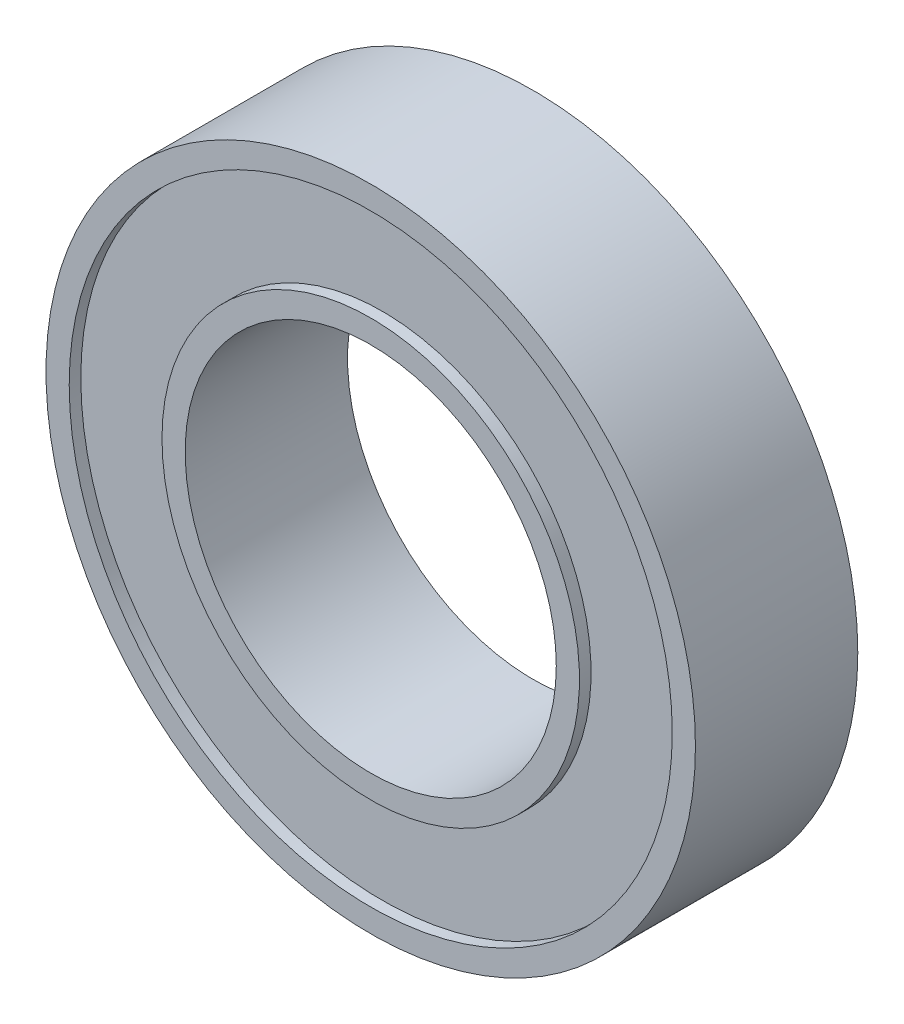
ISO-10303-21;
HEADER;
FILE_DESCRIPTION(('STEP AP214'),'2;1');
FILE_NAME('part.step','',(''),(''),'','','');
FILE_SCHEMA(('AUTOMOTIVE_DESIGN { 1 0 10303 214 1 1 1 1 }'));
ENDSEC;
DATA;
#1=APPLICATION_CONTEXT('core data for automotive mechanical design processes');
#2=APPLICATION_PROTOCOL_DEFINITION('international standard','automotive_design',2000,#1);
#3=PRODUCT_CONTEXT('',#1,'mechanical');
#4=PRODUCT('Part','Part','',(#3));
#5=PRODUCT_RELATED_PRODUCT_CATEGORY('part','',(#4));
#6=PRODUCT_DEFINITION_FORMATION('','',#4);
#7=PRODUCT_DEFINITION_CONTEXT('part definition',#1,'design');
#8=PRODUCT_DEFINITION('design','',#6,#7);
#9=PRODUCT_DEFINITION_SHAPE('','',#8);
#10=(LENGTH_UNIT() NAMED_UNIT(*) SI_UNIT(.MILLI.,.METRE.));
#11=(NAMED_UNIT(*) PLANE_ANGLE_UNIT() SI_UNIT($,.RADIAN.));
#12=(NAMED_UNIT(*) SI_UNIT($,.STERADIAN.) SOLID_ANGLE_UNIT());
#13=UNCERTAINTY_MEASURE_WITH_UNIT(LENGTH_MEASURE(1.E-05),#10,'distance_accuracy_value','');
#14=(GEOMETRIC_REPRESENTATION_CONTEXT(3) GLOBAL_UNCERTAINTY_ASSIGNED_CONTEXT((#13)) GLOBAL_UNIT_ASSIGNED_CONTEXT((#10,
#11,#12)) REPRESENTATION_CONTEXT('',''));
#15=CARTESIAN_POINT('',(0.,0.,0.));
#16=DIRECTION('',(0.,0.,1.));
#17=DIRECTION('',(1.,0.,0.));
#18=AXIS2_PLACEMENT_3D('',#15,#16,#17);
#19=CARTESIAN_POINT('',(0.,0.,-3.5));
#20=DIRECTION('',(0.,0.,1.));
#21=DIRECTION('',(1.,0.,0.));
#22=AXIS2_PLACEMENT_3D('',#19,#20,#21);
#23=PLANE('',#22);
#24=CARTESIAN_POINT('',(0.,0.,-3.5));
#25=DIRECTION('',(0.,0.,1.));
#26=DIRECTION('',(1.,0.,0.));
#27=AXIS2_PLACEMENT_3D('',#24,#25,#26);
#28=CIRCLE('',#27,8.);
#29=CARTESIAN_POINT('',(8.,0.,-3.5));
#30=VERTEX_POINT('',#29);
#31=EDGE_CURVE('E69',#30,#30,#28,.T.);
#32=ORIENTED_EDGE('',*,*,#31,.T.);
#33=EDGE_LOOP('',(#32));
#34=FACE_BOUND('',#33,.T.);
#35=CARTESIAN_POINT('',(0.,0.,-3.5));
#36=DIRECTION('',(0.,0.,1.));
#37=DIRECTION('',(1.,0.,0.));
#38=AXIS2_PLACEMENT_3D('',#35,#36,#37);
#39=CIRCLE('',#38,9.);
#40=CARTESIAN_POINT('',(9.,0.,-3.5));
#41=VERTEX_POINT('',#40);
#42=EDGE_CURVE('E80',#41,#41,#39,.T.);
#43=ORIENTED_EDGE('',*,*,#42,.F.);
#44=EDGE_LOOP('',(#43));
#45=FACE_BOUND('',#44,.T.);
#46=ADVANCED_FACE('F51',(#34,#45),#23,.F.);
#47=CARTESIAN_POINT('',(0.,0.,3.5));
#48=DIRECTION('',(0.,0.,1.));
#49=DIRECTION('',(1.,0.,0.));
#50=AXIS2_PLACEMENT_3D('',#47,#48,#49);
#51=PLANE('',#50);
#52=CARTESIAN_POINT('',(0.,0.,3.5));
#53=DIRECTION('',(0.,0.,1.));
#54=DIRECTION('',(1.,0.,0.));
#55=AXIS2_PLACEMENT_3D('',#52,#53,#54);
#56=CIRCLE('',#55,8.);
#57=CARTESIAN_POINT('',(8.,0.,3.5));
#58=VERTEX_POINT('',#57);
#59=EDGE_CURVE('E66',#58,#58,#56,.T.);
#60=ORIENTED_EDGE('',*,*,#59,.F.);
#61=EDGE_LOOP('',(#60));
#62=FACE_BOUND('',#61,.T.);
#63=CARTESIAN_POINT('',(0.,0.,3.5));
#64=DIRECTION('',(0.,0.,1.));
#65=DIRECTION('',(1.,0.,0.));
#66=AXIS2_PLACEMENT_3D('',#63,#64,#65);
#67=CIRCLE('',#66,9.);
#68=CARTESIAN_POINT('',(-9.,0.,3.5));
#69=VERTEX_POINT('',#68);
#70=EDGE_CURVE('E72',#69,#69,#67,.F.);
#71=ORIENTED_EDGE('',*,*,#70,.F.);
#72=EDGE_LOOP('',(#71));
#73=FACE_BOUND('',#72,.T.);
#74=ADVANCED_FACE('F130',(#62,#73),#51,.T.);
#75=CARTESIAN_POINT('',(0.,0.,3.5));
#76=DIRECTION('',(0.,0.,1.));
#77=DIRECTION('',(1.,0.,0.));
#78=AXIS2_PLACEMENT_3D('',#75,#76,#77);
#79=CIRCLE('',#78,13.);
#80=CARTESIAN_POINT('',(-13.,0.,3.5));
#81=VERTEX_POINT('',#80);
#82=EDGE_CURVE('E76',#81,#81,#79,.F.);
#83=ORIENTED_EDGE('',*,*,#82,.T.);
#84=EDGE_LOOP('',(#83));
#85=FACE_BOUND('',#84,.T.);
#86=CARTESIAN_POINT('',(0.,0.,3.5));
#87=DIRECTION('',(0.,0.,1.));
#88=DIRECTION('',(1.,0.,0.));
#89=AXIS2_PLACEMENT_3D('',#86,#87,#88);
#90=CIRCLE('',#89,14.);
#91=CARTESIAN_POINT('',(14.,0.,3.5));
#92=VERTEX_POINT('',#91);
#93=EDGE_CURVE('E10',#92,#92,#90,.T.);
#94=ORIENTED_EDGE('',*,*,#93,.T.);
#95=EDGE_LOOP('',(#94));
#96=FACE_BOUND('',#95,.T.);
#97=ADVANCED_FACE('F135',(#85,#96),#51,.T.);
#98=CARTESIAN_POINT('',(0.,0.,-3.5));
#99=DIRECTION('',(0.,0.,1.));
#100=DIRECTION('',(1.,0.,0.));
#101=AXIS2_PLACEMENT_3D('',#98,#99,#100);
#102=CIRCLE('',#101,13.);
#103=CARTESIAN_POINT('',(13.,0.,-3.5));
#104=VERTEX_POINT('',#103);
#105=EDGE_CURVE('E55',#104,#104,#102,.T.);
#106=ORIENTED_EDGE('',*,*,#105,.T.);
#107=EDGE_LOOP('',(#106));
#108=FACE_BOUND('',#107,.T.);
#109=CARTESIAN_POINT('',(0.,0.,-3.5));
#110=DIRECTION('',(0.,0.,1.));
#111=DIRECTION('',(1.,0.,0.));
#112=AXIS2_PLACEMENT_3D('',#109,#110,#111);
#113=CIRCLE('',#112,14.);
#114=CARTESIAN_POINT('',(14.,0.,-3.5));
#115=VERTEX_POINT('',#114);
#116=EDGE_CURVE('E60',#115,#115,#113,.T.);
#117=ORIENTED_EDGE('',*,*,#116,.F.);
#118=EDGE_LOOP('',(#117));
#119=FACE_BOUND('',#118,.T.);
#120=ADVANCED_FACE('F126',(#108,#119),#23,.F.);
#121=CARTESIAN_POINT('',(0.,0.,3.5));
#122=DIRECTION('',(0.,0.,-1.));
#123=DIRECTION('',(-1.,0.,0.));
#124=AXIS2_PLACEMENT_3D('',#121,#122,#123);
#125=CYLINDRICAL_SURFACE('',#124,14.);
#126=ORIENTED_EDGE('',*,*,#93,.F.);
#127=EDGE_LOOP('',(#126));
#128=FACE_BOUND('',#127,.T.);
#129=ORIENTED_EDGE('',*,*,#116,.T.);
#130=EDGE_LOOP('',(#129));
#131=FACE_BOUND('',#130,.T.);
#132=ADVANCED_FACE('F53',(#128,#131),#125,.T.);
#133=CARTESIAN_POINT('',(0.,0.,3.5));
#134=DIRECTION('',(0.,0.,-1.));
#135=DIRECTION('',(-1.,0.,0.));
#136=AXIS2_PLACEMENT_3D('',#133,#134,#135);
#137=CYLINDRICAL_SURFACE('',#136,8.);
#138=ORIENTED_EDGE('',*,*,#59,.T.);
#139=EDGE_LOOP('',(#138));
#140=FACE_BOUND('',#139,.T.);
#141=ORIENTED_EDGE('',*,*,#31,.F.);
#142=EDGE_LOOP('',(#141));
#143=FACE_BOUND('',#142,.T.);
#144=ADVANCED_FACE('F114',(#140,#143),#137,.F.);
#145=CARTESIAN_POINT('',(0.,0.,3.500012));
#146=DIRECTION('',(0.,0.,-1.));
#147=DIRECTION('',(-1.,0.,0.));
#148=AXIS2_PLACEMENT_3D('',#145,#146,#147);
#149=CYLINDRICAL_SURFACE('',#148,13.);
#150=CARTESIAN_POINT('',(0.,0.,3.));
#151=DIRECTION('',(0.,0.,1.));
#152=DIRECTION('',(1.,0.,0.));
#153=AXIS2_PLACEMENT_3D('',#150,#151,#152);
#154=CIRCLE('',#153,13.);
#155=CARTESIAN_POINT('',(-13.,0.,3.));
#156=VERTEX_POINT('',#155);
#157=EDGE_CURVE('E77',#156,#156,#154,.T.);
#158=CARTESIAN_POINT('',(-13.,0.,3.5));
#159=CARTESIAN_POINT('',(-13.,0.,3.49479166666667));
#160=CARTESIAN_POINT('',(-13.,0.,3.48958333333333));
#161=CARTESIAN_POINT('',(-13.,0.,3.47916666666667));
#162=CARTESIAN_POINT('',(-13.,0.,3.47395833333333));
#163=CARTESIAN_POINT('',(-13.,0.,3.46354166666667));
#164=CARTESIAN_POINT('',(-13.,0.,3.45833333333333));
#165=CARTESIAN_POINT('',(-13.,0.,3.44791666666667));
#166=CARTESIAN_POINT('',(-13.,0.,3.44270833333333));
#167=CARTESIAN_POINT('',(-13.,0.,3.43229166666667));
#168=CARTESIAN_POINT('',(-13.,0.,3.42708333333333));
#169=CARTESIAN_POINT('',(-13.,0.,3.41666666666667));
#170=CARTESIAN_POINT('',(-13.,0.,3.41145833333333));
#171=CARTESIAN_POINT('',(-13.,0.,3.40104166666667));
#172=CARTESIAN_POINT('',(-13.,0.,3.39583333333333));
#173=CARTESIAN_POINT('',(-13.,0.,3.38541666666667));
#174=CARTESIAN_POINT('',(-13.,0.,3.38020833333333));
#175=CARTESIAN_POINT('',(-13.,0.,3.36979166666667));
#176=CARTESIAN_POINT('',(-13.,0.,3.36458333333333));
#177=CARTESIAN_POINT('',(-13.,0.,3.35416666666667));
#178=CARTESIAN_POINT('',(-13.,0.,3.34895833333333));
#179=CARTESIAN_POINT('',(-13.,0.,3.33854166666667));
#180=CARTESIAN_POINT('',(-13.,0.,3.33333333333333));
#181=CARTESIAN_POINT('',(-13.,0.,3.32291666666667));
#182=CARTESIAN_POINT('',(-13.,0.,3.31770833333333));
#183=CARTESIAN_POINT('',(-13.,0.,3.30729166666667));
#184=CARTESIAN_POINT('',(-13.,0.,3.30208333333333));
#185=CARTESIAN_POINT('',(-13.,0.,3.29166666666667));
#186=CARTESIAN_POINT('',(-13.,0.,3.28645833333333));
#187=CARTESIAN_POINT('',(-13.,0.,3.27604166666667));
#188=CARTESIAN_POINT('',(-13.,0.,3.27083333333333));
#189=CARTESIAN_POINT('',(-13.,0.,3.26041666666667));
#190=CARTESIAN_POINT('',(-13.,0.,3.25520833333333));
#191=CARTESIAN_POINT('',(-13.,0.,3.24479166666667));
#192=CARTESIAN_POINT('',(-13.,0.,3.23958333333333));
#193=CARTESIAN_POINT('',(-13.,0.,3.22916666666667));
#194=CARTESIAN_POINT('',(-13.,0.,3.22395833333333));
#195=CARTESIAN_POINT('',(-13.,0.,3.21354166666667));
#196=CARTESIAN_POINT('',(-13.,0.,3.20833333333333));
#197=CARTESIAN_POINT('',(-13.,0.,3.19791666666667));
#198=CARTESIAN_POINT('',(-13.,0.,3.19270833333333));
#199=CARTESIAN_POINT('',(-13.,0.,3.18229166666667));
#200=CARTESIAN_POINT('',(-13.,0.,3.17708333333333));
#201=CARTESIAN_POINT('',(-13.,0.,3.16666666666667));
#202=CARTESIAN_POINT('',(-13.,0.,3.16145833333333));
#203=CARTESIAN_POINT('',(-13.,0.,3.15104166666667));
#204=CARTESIAN_POINT('',(-13.,0.,3.14583333333333));
#205=CARTESIAN_POINT('',(-13.,0.,3.13541666666667));
#206=CARTESIAN_POINT('',(-13.,0.,3.13020833333333));
#207=CARTESIAN_POINT('',(-13.,0.,3.11979166666667));
#208=CARTESIAN_POINT('',(-13.,0.,3.11458333333333));
#209=CARTESIAN_POINT('',(-13.,0.,3.10416666666667));
#210=CARTESIAN_POINT('',(-13.,0.,3.09895833333333));
#211=CARTESIAN_POINT('',(-13.,0.,3.08854166666667));
#212=CARTESIAN_POINT('',(-13.,0.,3.08333333333333));
#213=CARTESIAN_POINT('',(-13.,0.,3.07291666666667));
#214=CARTESIAN_POINT('',(-13.,0.,3.06770833333333));
#215=CARTESIAN_POINT('',(-13.,0.,3.05729166666667));
#216=CARTESIAN_POINT('',(-13.,0.,3.05208333333333));
#217=CARTESIAN_POINT('',(-13.,0.,3.04166666666667));
#218=CARTESIAN_POINT('',(-13.,0.,3.03645833333333));
#219=CARTESIAN_POINT('',(-13.,0.,3.02604166666667));
#220=CARTESIAN_POINT('',(-13.,0.,3.02083333333333));
#221=CARTESIAN_POINT('',(-13.,0.,3.01041666666667));
#222=CARTESIAN_POINT('',(-13.,0.,3.00520833333333));
#223=CARTESIAN_POINT('',(-13.,0.,3.));
#224=B_SPLINE_CURVE_WITH_KNOTS('',3,(#158,#159,#160,#161,#162,#163,#164,#165,#166,#167,#168,
#169,#170,#171,#172,#173,#174,#175,#176,#177,#178,#179,#180,#181,#182,#183,#184,#185,#186,#187,
#188,#189,#190,#191,#192,#193,#194,#195,#196,#197,#198,#199,#200,#201,#202,#203,#204,#205,#206,
#207,#208,#209,#210,#211,#212,#213,#214,#215,#216,#217,#218,#219,#220,#221,#222,#223),
.UNSPECIFIED.,.F.,.F.,(4,2,2,2,2,2,2,2,2,2,2,2,2,2,2,2,2,2,2,2,2,2,2,2,2,2,2,2,2,2,2,2,4),(0.,
0.015625,0.03125,0.046875,0.0625000000000001,0.0781250000000001,0.0937500000000001,0.109375,
0.125,0.140625,0.15625,0.171875,0.1875,0.203125,0.21875,0.234375,0.25,0.265625,0.28125,0.296875,
0.3125,0.328125,0.34375,0.359375,0.375,0.390625,0.40625,0.421875,0.4375,0.453125,0.46875,
0.484375,0.5),.UNSPECIFIED.);
#225=EDGE_CURVE('BSEAM116',#81,#156,#224,.T.);
#226=ORIENTED_EDGE('',*,*,#82,.F.);
#227=ORIENTED_EDGE('',*,*,#157,.F.);
#228=ORIENTED_EDGE('',*,*,#225,.T.);
#229=ORIENTED_EDGE('',*,*,#225,.F.);
#230=EDGE_LOOP('',(#226,#228,#227,#229));
#231=FACE_BOUND('',#230,.T.);
#232=ADVANCED_FACE('F116',(#231),#149,.F.);
#233=CARTESIAN_POINT('',(0.,0.,3.500012));
#234=DIRECTION('',(0.,0.,-1.));
#235=DIRECTION('',(-1.,0.,0.));
#236=AXIS2_PLACEMENT_3D('',#233,#234,#235);
#237=CYLINDRICAL_SURFACE('',#236,9.);
#238=CARTESIAN_POINT('',(0.,0.,3.));
#239=DIRECTION('',(0.,0.,1.));
#240=DIRECTION('',(1.,0.,0.));
#241=AXIS2_PLACEMENT_3D('',#238,#239,#240);
#242=CIRCLE('',#241,9.);
#243=CARTESIAN_POINT('',(-9.,0.,3.));
#244=VERTEX_POINT('',#243);
#245=EDGE_CURVE('E89',#244,#244,#242,.T.);
#246=CARTESIAN_POINT('',(-9.,0.,3.5));
#247=CARTESIAN_POINT('',(-9.,0.,3.49479166666667));
#248=CARTESIAN_POINT('',(-9.,0.,3.48958333333333));
#249=CARTESIAN_POINT('',(-9.,0.,3.47916666666667));
#250=CARTESIAN_POINT('',(-9.,0.,3.47395833333333));
#251=CARTESIAN_POINT('',(-9.,0.,3.46354166666667));
#252=CARTESIAN_POINT('',(-9.,0.,3.45833333333333));
#253=CARTESIAN_POINT('',(-9.,0.,3.44791666666667));
#254=CARTESIAN_POINT('',(-9.,0.,3.44270833333333));
#255=CARTESIAN_POINT('',(-9.,0.,3.43229166666667));
#256=CARTESIAN_POINT('',(-9.,0.,3.42708333333333));
#257=CARTESIAN_POINT('',(-9.,0.,3.41666666666667));
#258=CARTESIAN_POINT('',(-9.,0.,3.41145833333333));
#259=CARTESIAN_POINT('',(-9.,0.,3.40104166666667));
#260=CARTESIAN_POINT('',(-9.,0.,3.39583333333333));
#261=CARTESIAN_POINT('',(-9.,0.,3.38541666666667));
#262=CARTESIAN_POINT('',(-9.,0.,3.38020833333333));
#263=CARTESIAN_POINT('',(-9.,0.,3.36979166666667));
#264=CARTESIAN_POINT('',(-9.,0.,3.36458333333333));
#265=CARTESIAN_POINT('',(-9.,0.,3.35416666666667));
#266=CARTESIAN_POINT('',(-9.,0.,3.34895833333333));
#267=CARTESIAN_POINT('',(-9.,0.,3.33854166666667));
#268=CARTESIAN_POINT('',(-9.,0.,3.33333333333333));
#269=CARTESIAN_POINT('',(-9.,0.,3.32291666666667));
#270=CARTESIAN_POINT('',(-9.,0.,3.31770833333333));
#271=CARTESIAN_POINT('',(-9.,0.,3.30729166666667));
#272=CARTESIAN_POINT('',(-9.,0.,3.30208333333333));
#273=CARTESIAN_POINT('',(-9.,0.,3.29166666666667));
#274=CARTESIAN_POINT('',(-9.,0.,3.28645833333333));
#275=CARTESIAN_POINT('',(-9.,0.,3.27604166666667));
#276=CARTESIAN_POINT('',(-9.,0.,3.27083333333333));
#277=CARTESIAN_POINT('',(-9.,0.,3.26041666666667));
#278=CARTESIAN_POINT('',(-9.,0.,3.25520833333333));
#279=CARTESIAN_POINT('',(-9.,0.,3.24479166666667));
#280=CARTESIAN_POINT('',(-9.,0.,3.23958333333333));
#281=CARTESIAN_POINT('',(-9.,0.,3.22916666666667));
#282=CARTESIAN_POINT('',(-9.,0.,3.22395833333333));
#283=CARTESIAN_POINT('',(-9.,0.,3.21354166666667));
#284=CARTESIAN_POINT('',(-9.,0.,3.20833333333333));
#285=CARTESIAN_POINT('',(-9.,0.,3.19791666666667));
#286=CARTESIAN_POINT('',(-9.,0.,3.19270833333333));
#287=CARTESIAN_POINT('',(-9.,0.,3.18229166666667));
#288=CARTESIAN_POINT('',(-9.,0.,3.17708333333333));
#289=CARTESIAN_POINT('',(-9.,0.,3.16666666666667));
#290=CARTESIAN_POINT('',(-9.,0.,3.16145833333333));
#291=CARTESIAN_POINT('',(-9.,0.,3.15104166666667));
#292=CARTESIAN_POINT('',(-9.,0.,3.14583333333333));
#293=CARTESIAN_POINT('',(-9.,0.,3.13541666666667));
#294=CARTESIAN_POINT('',(-9.,0.,3.13020833333333));
#295=CARTESIAN_POINT('',(-9.,0.,3.11979166666667));
#296=CARTESIAN_POINT('',(-9.,0.,3.11458333333333));
#297=CARTESIAN_POINT('',(-9.,0.,3.10416666666667));
#298=CARTESIAN_POINT('',(-9.,0.,3.09895833333333));
#299=CARTESIAN_POINT('',(-9.,0.,3.08854166666667));
#300=CARTESIAN_POINT('',(-9.,0.,3.08333333333333));
#301=CARTESIAN_POINT('',(-9.,0.,3.07291666666667));
#302=CARTESIAN_POINT('',(-9.,0.,3.06770833333333));
#303=CARTESIAN_POINT('',(-9.,0.,3.05729166666667));
#304=CARTESIAN_POINT('',(-9.,0.,3.05208333333333));
#305=CARTESIAN_POINT('',(-9.,0.,3.04166666666667));
#306=CARTESIAN_POINT('',(-9.,0.,3.03645833333333));
#307=CARTESIAN_POINT('',(-9.,0.,3.02604166666667));
#308=CARTESIAN_POINT('',(-9.,0.,3.02083333333333));
#309=CARTESIAN_POINT('',(-9.,0.,3.01041666666667));
#310=CARTESIAN_POINT('',(-9.,0.,3.00520833333333));
#311=CARTESIAN_POINT('',(-9.,0.,3.));
#312=B_SPLINE_CURVE_WITH_KNOTS('',3,(#246,#247,#248,#249,#250,#251,#252,#253,#254,#255,#256,
#257,#258,#259,#260,#261,#262,#263,#264,#265,#266,#267,#268,#269,#270,#271,#272,#273,#274,#275,
#276,#277,#278,#279,#280,#281,#282,#283,#284,#285,#286,#287,#288,#289,#290,#291,#292,#293,#294,
#295,#296,#297,#298,#299,#300,#301,#302,#303,#304,#305,#306,#307,#308,#309,#310,#311),
.UNSPECIFIED.,.F.,.F.,(4,2,2,2,2,2,2,2,2,2,2,2,2,2,2,2,2,2,2,2,2,2,2,2,2,2,2,2,2,2,2,2,4),(0.,
0.015625,0.03125,0.046875,0.0625000000000001,0.0781250000000001,0.0937500000000001,0.109375,
0.125,0.140625,0.15625,0.171875,0.1875,0.203125,0.21875,0.234375,0.25,0.265625,0.28125,0.296875,
0.3125,0.328125,0.34375,0.359375,0.375,0.390625,0.40625,0.421875,0.4375,0.453125,0.46875,
0.484375,0.5),.UNSPECIFIED.);
#313=EDGE_CURVE('BSEAM123',#69,#244,#312,.T.);
#314=ORIENTED_EDGE('',*,*,#70,.T.);
#315=ORIENTED_EDGE('',*,*,#245,.T.);
#316=ORIENTED_EDGE('',*,*,#313,.T.);
#317=ORIENTED_EDGE('',*,*,#313,.F.);
#318=EDGE_LOOP('',(#314,#316,#315,#317));
#319=FACE_BOUND('',#318,.T.);
#320=ADVANCED_FACE('F123',(#319),#237,.T.);
#321=CARTESIAN_POINT('',(0.,0.,3.));
#322=DIRECTION('',(0.,0.,1.));
#323=DIRECTION('',(1.,0.,0.));
#324=AXIS2_PLACEMENT_3D('',#321,#322,#323);
#325=PLANE('',#324);
#326=ORIENTED_EDGE('',*,*,#245,.F.);
#327=EDGE_LOOP('',(#326));
#328=FACE_BOUND('',#327,.T.);
#329=ORIENTED_EDGE('',*,*,#157,.T.);
#330=EDGE_LOOP('',(#329));
#331=FACE_BOUND('',#330,.T.);
#332=ADVANCED_FACE('F151',(#328,#331),#325,.T.);
#333=CARTESIAN_POINT('',(0.,0.,-3.500012));
#334=DIRECTION('',(0.,0.,1.));
#335=DIRECTION('',(1.,0.,0.));
#336=AXIS2_PLACEMENT_3D('',#333,#334,#335);
#337=CYLINDRICAL_SURFACE('',#336,13.);
#338=CARTESIAN_POINT('',(0.,0.,-3.));
#339=DIRECTION('',(0.,0.,1.));
#340=DIRECTION('',(1.,0.,0.));
#341=AXIS2_PLACEMENT_3D('',#338,#339,#340);
#342=CIRCLE('',#341,13.);
#343=CARTESIAN_POINT('',(13.,0.,-3.));
#344=VERTEX_POINT('',#343);
#345=EDGE_CURVE('E83',#344,#344,#342,.T.);
#346=CARTESIAN_POINT('',(13.,0.,-3.));
#347=CARTESIAN_POINT('',(13.,0.,-3.00520833333333));
#348=CARTESIAN_POINT('',(13.,0.,-3.01041666666667));
#349=CARTESIAN_POINT('',(13.,0.,-3.02083333333333));
#350=CARTESIAN_POINT('',(13.,0.,-3.02604166666667));
#351=CARTESIAN_POINT('',(13.,0.,-3.03645833333333));
#352=CARTESIAN_POINT('',(13.,0.,-3.04166666666667));
#353=CARTESIAN_POINT('',(13.,0.,-3.05208333333333));
#354=CARTESIAN_POINT('',(13.,0.,-3.05729166666667));
#355=CARTESIAN_POINT('',(13.,0.,-3.06770833333333));
#356=CARTESIAN_POINT('',(13.,0.,-3.07291666666667));
#357=CARTESIAN_POINT('',(13.,0.,-3.08333333333333));
#358=CARTESIAN_POINT('',(13.,0.,-3.08854166666667));
#359=CARTESIAN_POINT('',(13.,0.,-3.09895833333333));
#360=CARTESIAN_POINT('',(13.,0.,-3.10416666666667));
#361=CARTESIAN_POINT('',(13.,0.,-3.11458333333333));
#362=CARTESIAN_POINT('',(13.,0.,-3.11979166666667));
#363=CARTESIAN_POINT('',(13.,0.,-3.13020833333333));
#364=CARTESIAN_POINT('',(13.,0.,-3.13541666666667));
#365=CARTESIAN_POINT('',(13.,0.,-3.14583333333333));
#366=CARTESIAN_POINT('',(13.,0.,-3.15104166666667));
#367=CARTESIAN_POINT('',(13.,0.,-3.16145833333333));
#368=CARTESIAN_POINT('',(13.,0.,-3.16666666666667));
#369=CARTESIAN_POINT('',(13.,0.,-3.17708333333333));
#370=CARTESIAN_POINT('',(13.,0.,-3.18229166666667));
#371=CARTESIAN_POINT('',(13.,0.,-3.19270833333333));
#372=CARTESIAN_POINT('',(13.,0.,-3.19791666666667));
#373=CARTESIAN_POINT('',(13.,0.,-3.20833333333333));
#374=CARTESIAN_POINT('',(13.,0.,-3.21354166666667));
#375=CARTESIAN_POINT('',(13.,0.,-3.22395833333333));
#376=CARTESIAN_POINT('',(13.,0.,-3.22916666666667));
#377=CARTESIAN_POINT('',(13.,0.,-3.23958333333333));
#378=CARTESIAN_POINT('',(13.,0.,-3.24479166666667));
#379=CARTESIAN_POINT('',(13.,0.,-3.25520833333333));
#380=CARTESIAN_POINT('',(13.,0.,-3.26041666666667));
#381=CARTESIAN_POINT('',(13.,0.,-3.27083333333333));
#382=CARTESIAN_POINT('',(13.,0.,-3.27604166666667));
#383=CARTESIAN_POINT('',(13.,0.,-3.28645833333333));
#384=CARTESIAN_POINT('',(13.,0.,-3.29166666666667));
#385=CARTESIAN_POINT('',(13.,0.,-3.30208333333333));
#386=CARTESIAN_POINT('',(13.,0.,-3.30729166666667));
#387=CARTESIAN_POINT('',(13.,0.,-3.31770833333333));
#388=CARTESIAN_POINT('',(13.,0.,-3.32291666666667));
#389=CARTESIAN_POINT('',(13.,0.,-3.33333333333333));
#390=CARTESIAN_POINT('',(13.,0.,-3.33854166666667));
#391=CARTESIAN_POINT('',(13.,0.,-3.34895833333333));
#392=CARTESIAN_POINT('',(13.,0.,-3.35416666666667));
#393=CARTESIAN_POINT('',(13.,0.,-3.36458333333333));
#394=CARTESIAN_POINT('',(13.,0.,-3.36979166666667));
#395=CARTESIAN_POINT('',(13.,0.,-3.38020833333333));
#396=CARTESIAN_POINT('',(13.,0.,-3.38541666666667));
#397=CARTESIAN_POINT('',(13.,0.,-3.39583333333333));
#398=CARTESIAN_POINT('',(13.,0.,-3.40104166666667));
#399=CARTESIAN_POINT('',(13.,0.,-3.41145833333333));
#400=CARTESIAN_POINT('',(13.,0.,-3.41666666666667));
#401=CARTESIAN_POINT('',(13.,0.,-3.42708333333333));
#402=CARTESIAN_POINT('',(13.,0.,-3.43229166666667));
#403=CARTESIAN_POINT('',(13.,0.,-3.44270833333333));
#404=CARTESIAN_POINT('',(13.,0.,-3.44791666666667));
#405=CARTESIAN_POINT('',(13.,0.,-3.45833333333333));
#406=CARTESIAN_POINT('',(13.,0.,-3.46354166666667));
#407=CARTESIAN_POINT('',(13.,0.,-3.47395833333333));
#408=CARTESIAN_POINT('',(13.,0.,-3.47916666666667));
#409=CARTESIAN_POINT('',(13.,0.,-3.48958333333333));
#410=CARTESIAN_POINT('',(13.,0.,-3.49479166666667));
#411=CARTESIAN_POINT('',(13.,0.,-3.5));
#412=B_SPLINE_CURVE_WITH_KNOTS('',3,(#346,#347,#348,#349,#350,#351,#352,#353,#354,#355,#356,
#357,#358,#359,#360,#361,#362,#363,#364,#365,#366,#367,#368,#369,#370,#371,#372,#373,#374,#375,
#376,#377,#378,#379,#380,#381,#382,#383,#384,#385,#386,#387,#388,#389,#390,#391,#392,#393,#394,
#395,#396,#397,#398,#399,#400,#401,#402,#403,#404,#405,#406,#407,#408,#409,#410,#411),
.UNSPECIFIED.,.F.,.F.,(4,2,2,2,2,2,2,2,2,2,2,2,2,2,2,2,2,2,2,2,2,2,2,2,2,2,2,2,2,2,2,2,4),(0.,
0.015625,0.03125,0.0468749999999996,0.0624999999999996,0.0781249999999996,0.0937499999999997,
0.109375,0.125,0.140625,0.15625,0.171875,0.1875,0.203125,0.21875,0.234375,0.25,0.265625,0.28125,
0.296875,0.3125,0.328125,0.34375,0.359375,0.375,0.390625,0.40625,0.421875,0.4375,0.453125,
0.46875,0.484375,0.5),.UNSPECIFIED.);
#413=EDGE_CURVE('BSEAM148',#344,#104,#412,.T.);
#414=ORIENTED_EDGE('',*,*,#345,.T.);
#415=ORIENTED_EDGE('',*,*,#105,.F.);
#416=ORIENTED_EDGE('',*,*,#413,.T.);
#417=ORIENTED_EDGE('',*,*,#413,.F.);
#418=EDGE_LOOP('',(#414,#416,#415,#417));
#419=FACE_BOUND('',#418,.T.);
#420=ADVANCED_FACE('F148',(#419),#337,.F.);
#421=CARTESIAN_POINT('',(0.,0.,-3.500012));
#422=DIRECTION('',(0.,0.,1.));
#423=DIRECTION('',(1.,0.,0.));
#424=AXIS2_PLACEMENT_3D('',#421,#422,#423);
#425=CYLINDRICAL_SURFACE('',#424,9.);
#426=CARTESIAN_POINT('',(0.,0.,-3.));
#427=DIRECTION('',(0.,0.,1.));
#428=DIRECTION('',(1.,0.,0.));
#429=AXIS2_PLACEMENT_3D('',#426,#427,#428);
#430=CIRCLE('',#429,9.);
#431=CARTESIAN_POINT('',(9.,0.,-3.));
#432=VERTEX_POINT('',#431);
#433=EDGE_CURVE('E91',#432,#432,#430,.T.);
#434=CARTESIAN_POINT('',(9.,0.,-3.));
#435=CARTESIAN_POINT('',(9.,0.,-3.00520833333333));
#436=CARTESIAN_POINT('',(9.,0.,-3.01041666666667));
#437=CARTESIAN_POINT('',(9.,0.,-3.02083333333333));
#438=CARTESIAN_POINT('',(9.,0.,-3.02604166666667));
#439=CARTESIAN_POINT('',(9.,0.,-3.03645833333333));
#440=CARTESIAN_POINT('',(9.,0.,-3.04166666666667));
#441=CARTESIAN_POINT('',(9.,0.,-3.05208333333333));
#442=CARTESIAN_POINT('',(9.,0.,-3.05729166666667));
#443=CARTESIAN_POINT('',(9.,0.,-3.06770833333333));
#444=CARTESIAN_POINT('',(9.,0.,-3.07291666666667));
#445=CARTESIAN_POINT('',(9.,0.,-3.08333333333333));
#446=CARTESIAN_POINT('',(9.,0.,-3.08854166666667));
#447=CARTESIAN_POINT('',(9.,0.,-3.09895833333333));
#448=CARTESIAN_POINT('',(9.,0.,-3.10416666666667));
#449=CARTESIAN_POINT('',(9.,0.,-3.11458333333333));
#450=CARTESIAN_POINT('',(9.,0.,-3.11979166666667));
#451=CARTESIAN_POINT('',(9.,0.,-3.13020833333333));
#452=CARTESIAN_POINT('',(9.,0.,-3.13541666666667));
#453=CARTESIAN_POINT('',(9.,0.,-3.14583333333333));
#454=CARTESIAN_POINT('',(9.,0.,-3.15104166666667));
#455=CARTESIAN_POINT('',(9.,0.,-3.16145833333333));
#456=CARTESIAN_POINT('',(9.,0.,-3.16666666666667));
#457=CARTESIAN_POINT('',(9.,0.,-3.17708333333333));
#458=CARTESIAN_POINT('',(9.,0.,-3.18229166666667));
#459=CARTESIAN_POINT('',(9.,0.,-3.19270833333333));
#460=CARTESIAN_POINT('',(9.,0.,-3.19791666666667));
#461=CARTESIAN_POINT('',(9.,0.,-3.20833333333333));
#462=CARTESIAN_POINT('',(9.,0.,-3.21354166666667));
#463=CARTESIAN_POINT('',(9.,0.,-3.22395833333333));
#464=CARTESIAN_POINT('',(9.,0.,-3.22916666666667));
#465=CARTESIAN_POINT('',(9.,0.,-3.23958333333333));
#466=CARTESIAN_POINT('',(9.,0.,-3.24479166666667));
#467=CARTESIAN_POINT('',(9.,0.,-3.25520833333333));
#468=CARTESIAN_POINT('',(9.,0.,-3.26041666666667));
#469=CARTESIAN_POINT('',(9.,0.,-3.27083333333333));
#470=CARTESIAN_POINT('',(9.,0.,-3.27604166666667));
#471=CARTESIAN_POINT('',(9.,0.,-3.28645833333333));
#472=CARTESIAN_POINT('',(9.,0.,-3.29166666666667));
#473=CARTESIAN_POINT('',(9.,0.,-3.30208333333333));
#474=CARTESIAN_POINT('',(9.,0.,-3.30729166666667));
#475=CARTESIAN_POINT('',(9.,0.,-3.31770833333333));
#476=CARTESIAN_POINT('',(9.,0.,-3.32291666666667));
#477=CARTESIAN_POINT('',(9.,0.,-3.33333333333333));
#478=CARTESIAN_POINT('',(9.,0.,-3.33854166666667));
#479=CARTESIAN_POINT('',(9.,0.,-3.34895833333333));
#480=CARTESIAN_POINT('',(9.,0.,-3.35416666666667));
#481=CARTESIAN_POINT('',(9.,0.,-3.36458333333333));
#482=CARTESIAN_POINT('',(9.,0.,-3.36979166666667));
#483=CARTESIAN_POINT('',(9.,0.,-3.38020833333333));
#484=CARTESIAN_POINT('',(9.,0.,-3.38541666666667));
#485=CARTESIAN_POINT('',(9.,0.,-3.39583333333333));
#486=CARTESIAN_POINT('',(9.,0.,-3.40104166666667));
#487=CARTESIAN_POINT('',(9.,0.,-3.41145833333333));
#488=CARTESIAN_POINT('',(9.,0.,-3.41666666666667));
#489=CARTESIAN_POINT('',(9.,0.,-3.42708333333333));
#490=CARTESIAN_POINT('',(9.,0.,-3.43229166666667));
#491=CARTESIAN_POINT('',(9.,0.,-3.44270833333333));
#492=CARTESIAN_POINT('',(9.,0.,-3.44791666666667));
#493=CARTESIAN_POINT('',(9.,0.,-3.45833333333333));
#494=CARTESIAN_POINT('',(9.,0.,-3.46354166666667));
#495=CARTESIAN_POINT('',(9.,0.,-3.47395833333333));
#496=CARTESIAN_POINT('',(9.,0.,-3.47916666666667));
#497=CARTESIAN_POINT('',(9.,0.,-3.48958333333333));
#498=CARTESIAN_POINT('',(9.,0.,-3.49479166666667));
#499=CARTESIAN_POINT('',(9.,0.,-3.5));
#500=B_SPLINE_CURVE_WITH_KNOTS('',3,(#434,#435,#436,#437,#438,#439,#440,#441,#442,#443,#444,
#445,#446,#447,#448,#449,#450,#451,#452,#453,#454,#455,#456,#457,#458,#459,#460,#461,#462,#463,
#464,#465,#466,#467,#468,#469,#470,#471,#472,#473,#474,#475,#476,#477,#478,#479,#480,#481,#482,
#483,#484,#485,#486,#487,#488,#489,#490,#491,#492,#493,#494,#495,#496,#497,#498,#499),
.UNSPECIFIED.,.F.,.F.,(4,2,2,2,2,2,2,2,2,2,2,2,2,2,2,2,2,2,2,2,2,2,2,2,2,2,2,2,2,2,2,2,4),(0.,
0.015625,0.03125,0.0468749999999996,0.0624999999999996,0.0781249999999996,0.0937499999999997,
0.109375,0.125,0.140625,0.15625,0.171875,0.1875,0.203125,0.21875,0.234375,0.25,0.265625,0.28125,
0.296875,0.3125,0.328125,0.34375,0.359375,0.375,0.390625,0.40625,0.421875,0.4375,0.453125,
0.46875,0.484375,0.5),.UNSPECIFIED.);
#501=EDGE_CURVE('BSEAM150',#432,#41,#500,.T.);
#502=ORIENTED_EDGE('',*,*,#433,.F.);
#503=ORIENTED_EDGE('',*,*,#42,.T.);
#504=ORIENTED_EDGE('',*,*,#501,.T.);
#505=ORIENTED_EDGE('',*,*,#501,.F.);
#506=EDGE_LOOP('',(#502,#504,#503,#505));
#507=FACE_BOUND('',#506,.T.);
#508=ADVANCED_FACE('F150',(#507),#425,.T.);
#509=CARTESIAN_POINT('',(0.,0.,-3.));
#510=DIRECTION('',(0.,0.,-1.));
#511=DIRECTION('',(1.,0.,0.));
#512=AXIS2_PLACEMENT_3D('',#509,#510,#511);
#513=PLANE('',#512);
#514=ORIENTED_EDGE('',*,*,#345,.F.);
#515=EDGE_LOOP('',(#514));
#516=FACE_BOUND('',#515,.T.);
#517=ORIENTED_EDGE('',*,*,#433,.T.);
#518=EDGE_LOOP('',(#517));
#519=FACE_BOUND('',#518,.T.);
#520=ADVANCED_FACE('F157',(#516,#519),#513,.T.);
#521=CLOSED_SHELL('',(#46,#74,#97,#120,#132,#144,#232,#320,#332,#420,#508,#520));
#522=MANIFOLD_SOLID_BREP('B2',#521);
#523=ADVANCED_BREP_SHAPE_REPRESENTATION('',(#18,#522),#14);
#524=SHAPE_DEFINITION_REPRESENTATION(#9,#523);
ENDSEC;
END-ISO-10303-21;
